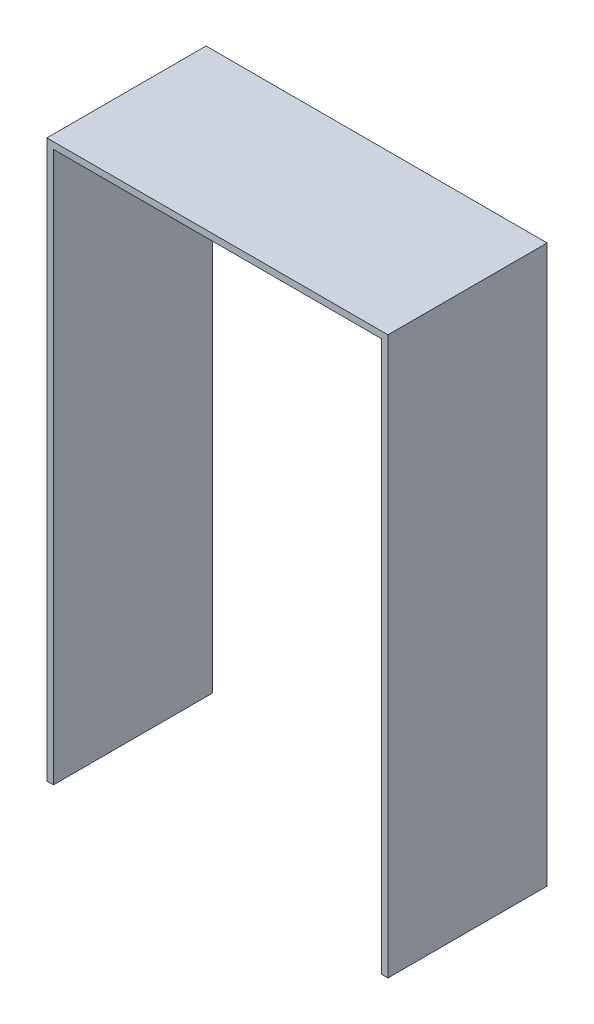
ISO-10303-21;
HEADER;
FILE_DESCRIPTION(('STEP AP214'),'2;1');
FILE_NAME('part.step','',(''),(''),'','','');
FILE_SCHEMA(('AUTOMOTIVE_DESIGN { 1 0 10303 214 1 1 1 1 }'));
ENDSEC;
DATA;
#1=APPLICATION_CONTEXT('core data for automotive mechanical design processes');
#2=APPLICATION_PROTOCOL_DEFINITION('international standard','automotive_design',2000,#1);
#3=PRODUCT_CONTEXT('',#1,'mechanical');
#4=PRODUCT('Part','Part','',(#3));
#5=PRODUCT_RELATED_PRODUCT_CATEGORY('part','',(#4));
#6=PRODUCT_DEFINITION_FORMATION('','',#4);
#7=PRODUCT_DEFINITION_CONTEXT('part definition',#1,'design');
#8=PRODUCT_DEFINITION('design','',#6,#7);
#9=PRODUCT_DEFINITION_SHAPE('','',#8);
#10=(LENGTH_UNIT() NAMED_UNIT(*) SI_UNIT(.MILLI.,.METRE.));
#11=(NAMED_UNIT(*) PLANE_ANGLE_UNIT() SI_UNIT($,.RADIAN.));
#12=(NAMED_UNIT(*) SI_UNIT($,.STERADIAN.) SOLID_ANGLE_UNIT());
#13=UNCERTAINTY_MEASURE_WITH_UNIT(LENGTH_MEASURE(1.E-05),#10,'distance_accuracy_value','');
#14=(GEOMETRIC_REPRESENTATION_CONTEXT(3) GLOBAL_UNCERTAINTY_ASSIGNED_CONTEXT((#13)) GLOBAL_UNIT_ASSIGNED_CONTEXT((#10,
#11,#12)) REPRESENTATION_CONTEXT('',''));
#15=CARTESIAN_POINT('',(0.,0.,0.));
#16=DIRECTION('',(0.,0.,1.));
#17=DIRECTION('',(1.,0.,0.));
#18=AXIS2_PLACEMENT_3D('',#15,#16,#17);
#19=CARTESIAN_POINT('',(-81.661,-133.35,76.2));
#20=DIRECTION('',(0.,1.,0.));
#21=DIRECTION('',(0.,0.,1.));
#22=AXIS2_PLACEMENT_3D('',#19,#20,#21);
#23=PLANE('',#22);
#24=DIRECTION('',(1.,0.,0.));
#25=VECTOR('',#24,1.);
#26=CARTESIAN_POINT('',(-81.661,-133.35,0.));
#27=LINE('',#26,#25);
#28=CARTESIAN_POINT('',(-81.661,-133.35,0.));
#29=VERTEX_POINT('',#28);
#30=CARTESIAN_POINT('',(-78.486,-133.35,0.));
#31=VERTEX_POINT('',#30);
#32=EDGE_CURVE('E130',#29,#31,#27,.T.);
#33=ORIENTED_EDGE('',*,*,#32,.T.);
#34=DIRECTION('',(0.,0.,1.));
#35=VECTOR('',#34,1.);
#36=CARTESIAN_POINT('',(-78.486,-133.35,0.));
#37=LINE('',#36,#35);
#38=CARTESIAN_POINT('',(-78.486,-133.35,76.2));
#39=VERTEX_POINT('',#38);
#40=EDGE_CURVE('E114',#31,#39,#37,.T.);
#41=ORIENTED_EDGE('',*,*,#40,.T.);
#42=DIRECTION('',(1.,0.,0.));
#43=VECTOR('',#42,1.);
#44=CARTESIAN_POINT('',(-81.661,-133.35,76.2));
#45=LINE('',#44,#43);
#46=CARTESIAN_POINT('',(-81.661,-133.35,76.2));
#47=VERTEX_POINT('',#46);
#48=EDGE_CURVE('E147',#47,#39,#45,.T.);
#49=ORIENTED_EDGE('',*,*,#48,.F.);
#50=DIRECTION('',(0.,0.,-1.));
#51=VECTOR('',#50,1.);
#52=CARTESIAN_POINT('',(-81.661,-133.35,76.2));
#53=LINE('',#52,#51);
#54=EDGE_CURVE('E137',#47,#29,#53,.T.);
#55=ORIENTED_EDGE('',*,*,#54,.T.);
#56=EDGE_LOOP('',(#33,#41,#49,#55));
#57=FACE_BOUND('',#56,.T.);
#58=ADVANCED_FACE('F39',(#57),#23,.F.);
#59=CARTESIAN_POINT('',(81.661,133.35,76.2));
#60=DIRECTION('',(-1.,0.,0.));
#61=DIRECTION('',(0.,-1.,0.));
#62=AXIS2_PLACEMENT_3D('',#59,#60,#61);
#63=PLANE('',#62);
#64=DIRECTION('',(0.,1.,0.));
#65=VECTOR('',#64,1.);
#66=CARTESIAN_POINT('',(81.661,133.35,0.));
#67=LINE('',#66,#65);
#68=CARTESIAN_POINT('',(81.661,-133.35,0.));
#69=VERTEX_POINT('',#68);
#70=CARTESIAN_POINT('',(81.661,133.35,0.));
#71=VERTEX_POINT('',#70);
#72=EDGE_CURVE('E155',#69,#71,#67,.T.);
#73=ORIENTED_EDGE('',*,*,#72,.T.);
#74=DIRECTION('',(0.,0.,-1.));
#75=VECTOR('',#74,1.);
#76=CARTESIAN_POINT('',(81.661,133.35,76.2));
#77=LINE('',#76,#75);
#78=CARTESIAN_POINT('',(81.661,133.35,76.2));
#79=VERTEX_POINT('',#78);
#80=EDGE_CURVE('E11',#79,#71,#77,.T.);
#81=ORIENTED_EDGE('',*,*,#80,.F.);
#82=DIRECTION('',(0.,1.,0.));
#83=VECTOR('',#82,1.);
#84=CARTESIAN_POINT('',(81.661,133.35,76.2));
#85=LINE('',#84,#83);
#86=CARTESIAN_POINT('',(81.661,-133.35,76.2));
#87=VERTEX_POINT('',#86);
#88=EDGE_CURVE('E138',#87,#79,#85,.T.);
#89=ORIENTED_EDGE('',*,*,#88,.F.);
#90=DIRECTION('',(0.,0.,-1.));
#91=VECTOR('',#90,1.);
#92=CARTESIAN_POINT('',(81.661,-133.35,76.2));
#93=LINE('',#92,#91);
#94=EDGE_CURVE('E145',#87,#69,#93,.T.);
#95=ORIENTED_EDGE('',*,*,#94,.T.);
#96=EDGE_LOOP('',(#73,#81,#89,#95));
#97=FACE_BOUND('',#96,.T.);
#98=ADVANCED_FACE('F41',(#97),#63,.F.);
#99=CARTESIAN_POINT('',(-81.661,133.35,76.2));
#100=DIRECTION('',(0.,-1.,0.));
#101=DIRECTION('',(0.,0.,-1.));
#102=AXIS2_PLACEMENT_3D('',#99,#100,#101);
#103=PLANE('',#102);
#104=DIRECTION('',(-1.,0.,0.));
#105=VECTOR('',#104,1.);
#106=CARTESIAN_POINT('',(-81.661,133.35,0.));
#107=LINE('',#106,#105);
#108=CARTESIAN_POINT('',(-81.661,133.35,0.));
#109=VERTEX_POINT('',#108);
#110=EDGE_CURVE('E154',#71,#109,#107,.T.);
#111=ORIENTED_EDGE('',*,*,#110,.T.);
#112=DIRECTION('',(0.,0.,-1.));
#113=VECTOR('',#112,1.);
#114=CARTESIAN_POINT('',(-81.661,133.35,76.2));
#115=LINE('',#114,#113);
#116=CARTESIAN_POINT('',(-81.661,133.35,76.2));
#117=VERTEX_POINT('',#116);
#118=EDGE_CURVE('E47',#117,#109,#115,.T.);
#119=ORIENTED_EDGE('',*,*,#118,.F.);
#120=DIRECTION('',(-1.,0.,0.));
#121=VECTOR('',#120,1.);
#122=CARTESIAN_POINT('',(-81.661,133.35,76.2));
#123=LINE('',#122,#121);
#124=EDGE_CURVE('E92',#79,#117,#123,.T.);
#125=ORIENTED_EDGE('',*,*,#124,.F.);
#126=ORIENTED_EDGE('',*,*,#80,.T.);
#127=EDGE_LOOP('',(#111,#119,#125,#126));
#128=FACE_BOUND('',#127,.T.);
#129=ADVANCED_FACE('F198',(#128),#103,.F.);
#130=CARTESIAN_POINT('',(-81.661,133.35,76.2));
#131=DIRECTION('',(1.,0.,0.));
#132=DIRECTION('',(0.,1.,0.));
#133=AXIS2_PLACEMENT_3D('',#130,#131,#132);
#134=PLANE('',#133);
#135=DIRECTION('',(0.,-1.,0.));
#136=VECTOR('',#135,1.);
#137=CARTESIAN_POINT('',(-81.661,133.35,0.));
#138=LINE('',#137,#136);
#139=EDGE_CURVE('E141',#109,#29,#138,.T.);
#140=ORIENTED_EDGE('',*,*,#139,.T.);
#141=ORIENTED_EDGE('',*,*,#54,.F.);
#142=DIRECTION('',(0.,-1.,0.));
#143=VECTOR('',#142,1.);
#144=CARTESIAN_POINT('',(-81.661,133.35,76.2));
#145=LINE('',#144,#143);
#146=EDGE_CURVE('E152',#117,#47,#145,.T.);
#147=ORIENTED_EDGE('',*,*,#146,.F.);
#148=ORIENTED_EDGE('',*,*,#118,.T.);
#149=EDGE_LOOP('',(#140,#141,#147,#148));
#150=FACE_BOUND('',#149,.T.);
#151=ADVANCED_FACE('F151',(#150),#134,.F.);
#152=CARTESIAN_POINT('',(78.486,-133.35,76.2));
#153=VERTEX_POINT('',#152);
#154=EDGE_CURVE('E63',#153,#87,#45,.T.);
#155=ORIENTED_EDGE('',*,*,#154,.F.);
#156=DIRECTION('',(0.,0.,1.));
#157=VECTOR('',#156,1.);
#158=CARTESIAN_POINT('',(78.486,-133.35,0.));
#159=LINE('',#158,#157);
#160=CARTESIAN_POINT('',(78.486,-133.35,0.));
#161=VERTEX_POINT('',#160);
#162=EDGE_CURVE('E124',#161,#153,#159,.T.);
#163=ORIENTED_EDGE('',*,*,#162,.F.);
#164=EDGE_CURVE('E85',#161,#69,#27,.T.);
#165=ORIENTED_EDGE('',*,*,#164,.T.);
#166=ORIENTED_EDGE('',*,*,#94,.F.);
#167=EDGE_LOOP('',(#155,#163,#165,#166));
#168=FACE_BOUND('',#167,.T.);
#169=ADVANCED_FACE('F176',(#168),#23,.F.);
#170=CARTESIAN_POINT('',(0.,0.,76.2));
#171=DIRECTION('',(0.,0.,1.));
#172=DIRECTION('',(1.,0.,0.));
#173=AXIS2_PLACEMENT_3D('',#170,#171,#172);
#174=PLANE('',#173);
#175=DIRECTION('',(0.,-1.,0.));
#176=VECTOR('',#175,1.);
#177=CARTESIAN_POINT('',(-78.486,-133.35,76.2));
#178=LINE('',#177,#176);
#179=CARTESIAN_POINT('',(-78.486,130.175,76.2));
#180=VERTEX_POINT('',#179);
#181=EDGE_CURVE('E119',#180,#39,#178,.T.);
#182=ORIENTED_EDGE('',*,*,#181,.F.);
#183=DIRECTION('',(-1.,0.,0.));
#184=VECTOR('',#183,1.);
#185=CARTESIAN_POINT('',(-78.486,130.175,76.2));
#186=LINE('',#185,#184);
#187=CARTESIAN_POINT('',(78.486,130.175,76.2));
#188=VERTEX_POINT('',#187);
#189=EDGE_CURVE('E133',#188,#180,#186,.T.);
#190=ORIENTED_EDGE('',*,*,#189,.F.);
#191=DIRECTION('',(0.,1.,0.));
#192=VECTOR('',#191,1.);
#193=CARTESIAN_POINT('',(78.486,-133.35,76.2));
#194=LINE('',#193,#192);
#195=EDGE_CURVE('E169',#153,#188,#194,.T.);
#196=ORIENTED_EDGE('',*,*,#195,.F.);
#197=ORIENTED_EDGE('',*,*,#154,.T.);
#198=ORIENTED_EDGE('',*,*,#88,.T.);
#199=ORIENTED_EDGE('',*,*,#124,.T.);
#200=ORIENTED_EDGE('',*,*,#146,.T.);
#201=ORIENTED_EDGE('',*,*,#48,.T.);
#202=EDGE_LOOP('',(#182,#190,#196,#197,#198,#199,#200,#201));
#203=FACE_BOUND('',#202,.T.);
#204=ADVANCED_FACE('F180',(#203),#174,.T.);
#205=CARTESIAN_POINT('',(0.,0.,0.));
#206=DIRECTION('',(0.,0.,1.));
#207=DIRECTION('',(1.,0.,0.));
#208=AXIS2_PLACEMENT_3D('',#205,#206,#207);
#209=PLANE('',#208);
#210=DIRECTION('',(-1.,0.,0.));
#211=VECTOR('',#210,1.);
#212=CARTESIAN_POINT('',(-78.486,130.175,0.));
#213=LINE('',#212,#211);
#214=CARTESIAN_POINT('',(78.486,130.175,0.));
#215=VERTEX_POINT('',#214);
#216=CARTESIAN_POINT('',(-78.486,130.175,0.));
#217=VERTEX_POINT('',#216);
#218=EDGE_CURVE('E54',#215,#217,#213,.T.);
#219=ORIENTED_EDGE('',*,*,#218,.T.);
#220=DIRECTION('',(0.,-1.,0.));
#221=VECTOR('',#220,1.);
#222=CARTESIAN_POINT('',(-78.486,-133.35,0.));
#223=LINE('',#222,#221);
#224=EDGE_CURVE('E117',#217,#31,#223,.T.);
#225=ORIENTED_EDGE('',*,*,#224,.T.);
#226=ORIENTED_EDGE('',*,*,#32,.F.);
#227=ORIENTED_EDGE('',*,*,#139,.F.);
#228=ORIENTED_EDGE('',*,*,#110,.F.);
#229=ORIENTED_EDGE('',*,*,#72,.F.);
#230=ORIENTED_EDGE('',*,*,#164,.F.);
#231=DIRECTION('',(0.,1.,0.));
#232=VECTOR('',#231,1.);
#233=CARTESIAN_POINT('',(78.486,-133.35,0.));
#234=LINE('',#233,#232);
#235=EDGE_CURVE('E132',#161,#215,#234,.T.);
#236=ORIENTED_EDGE('',*,*,#235,.T.);
#237=EDGE_LOOP('',(#219,#225,#226,#227,#228,#229,#230,#236));
#238=FACE_BOUND('',#237,.T.);
#239=ADVANCED_FACE('F128',(#238),#209,.F.);
#240=CARTESIAN_POINT('',(-78.486,-133.35,0.));
#241=DIRECTION('',(-1.,0.,0.));
#242=DIRECTION('',(0.,0.,1.));
#243=AXIS2_PLACEMENT_3D('',#240,#241,#242);
#244=PLANE('',#243);
#245=ORIENTED_EDGE('',*,*,#181,.T.);
#246=ORIENTED_EDGE('',*,*,#40,.F.);
#247=ORIENTED_EDGE('',*,*,#224,.F.);
#248=DIRECTION('',(0.,0.,1.));
#249=VECTOR('',#248,1.);
#250=CARTESIAN_POINT('',(-78.486,130.175,0.));
#251=LINE('',#250,#249);
#252=EDGE_CURVE('E157',#217,#180,#251,.T.);
#253=ORIENTED_EDGE('',*,*,#252,.T.);
#254=EDGE_LOOP('',(#245,#246,#247,#253));
#255=FACE_BOUND('',#254,.T.);
#256=ADVANCED_FACE('F116',(#255),#244,.F.);
#257=CARTESIAN_POINT('',(-78.486,130.175,0.));
#258=DIRECTION('',(0.,1.,0.));
#259=DIRECTION('',(0.,0.,1.));
#260=AXIS2_PLACEMENT_3D('',#257,#258,#259);
#261=PLANE('',#260);
#262=ORIENTED_EDGE('',*,*,#189,.T.);
#263=ORIENTED_EDGE('',*,*,#252,.F.);
#264=ORIENTED_EDGE('',*,*,#218,.F.);
#265=DIRECTION('',(0.,0.,1.));
#266=VECTOR('',#265,1.);
#267=CARTESIAN_POINT('',(78.486,130.175,0.));
#268=LINE('',#267,#266);
#269=EDGE_CURVE('E164',#215,#188,#268,.T.);
#270=ORIENTED_EDGE('',*,*,#269,.T.);
#271=EDGE_LOOP('',(#262,#263,#264,#270));
#272=FACE_BOUND('',#271,.T.);
#273=ADVANCED_FACE('F182',(#272),#261,.F.);
#274=CARTESIAN_POINT('',(78.486,-133.35,0.));
#275=DIRECTION('',(1.,0.,0.));
#276=DIRECTION('',(0.,1.,0.));
#277=AXIS2_PLACEMENT_3D('',#274,#275,#276);
#278=PLANE('',#277);
#279=ORIENTED_EDGE('',*,*,#195,.T.);
#280=ORIENTED_EDGE('',*,*,#269,.F.);
#281=ORIENTED_EDGE('',*,*,#235,.F.);
#282=ORIENTED_EDGE('',*,*,#162,.T.);
#283=EDGE_LOOP('',(#279,#280,#281,#282));
#284=FACE_BOUND('',#283,.T.);
#285=ADVANCED_FACE('F175',(#284),#278,.F.);
#286=CLOSED_SHELL('',(#58,#98,#129,#151,#169,#204,#239,#256,#273,#285));
#287=MANIFOLD_SOLID_BREP('B2',#286);
#288=ADVANCED_BREP_SHAPE_REPRESENTATION('',(#18,#287),#14);
#289=SHAPE_DEFINITION_REPRESENTATION(#9,#288);
ENDSEC;
END-ISO-10303-21;
